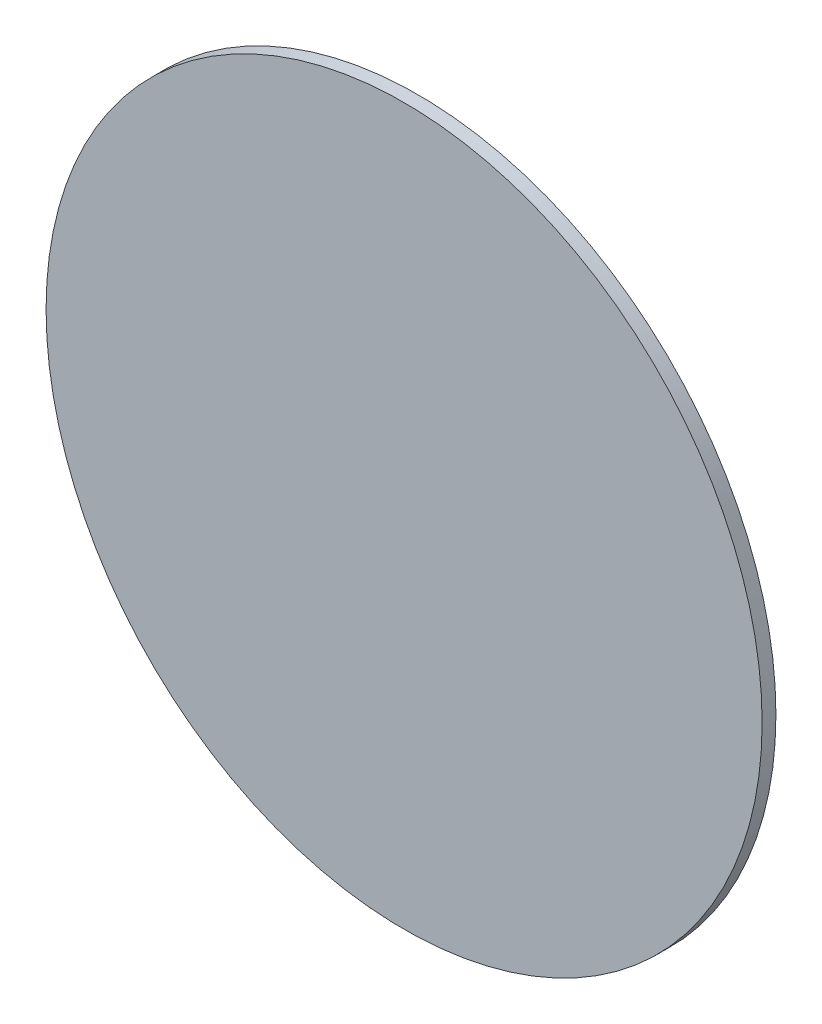
ISO-10303-21;
HEADER;
FILE_DESCRIPTION(('STEP AP214'),'2;1');
FILE_NAME('part.step','',(''),(''),'','','');
FILE_SCHEMA(('AUTOMOTIVE_DESIGN { 1 0 10303 214 1 1 1 1 }'));
ENDSEC;
DATA;
#1=APPLICATION_CONTEXT('core data for automotive mechanical design processes');
#2=APPLICATION_PROTOCOL_DEFINITION('international standard','automotive_design',2000,#1);
#3=PRODUCT_CONTEXT('',#1,'mechanical');
#4=PRODUCT('Part','Part','',(#3));
#5=PRODUCT_RELATED_PRODUCT_CATEGORY('part','',(#4));
#6=PRODUCT_DEFINITION_FORMATION('','',#4);
#7=PRODUCT_DEFINITION_CONTEXT('part definition',#1,'design');
#8=PRODUCT_DEFINITION('design','',#6,#7);
#9=PRODUCT_DEFINITION_SHAPE('','',#8);
#10=(LENGTH_UNIT() NAMED_UNIT(*) SI_UNIT(.MILLI.,.METRE.));
#11=(NAMED_UNIT(*) PLANE_ANGLE_UNIT() SI_UNIT($,.RADIAN.));
#12=(NAMED_UNIT(*) SI_UNIT($,.STERADIAN.) SOLID_ANGLE_UNIT());
#13=UNCERTAINTY_MEASURE_WITH_UNIT(LENGTH_MEASURE(1.E-05),#10,'distance_accuracy_value','');
#14=(GEOMETRIC_REPRESENTATION_CONTEXT(3) GLOBAL_UNCERTAINTY_ASSIGNED_CONTEXT((#13)) GLOBAL_UNIT_ASSIGNED_CONTEXT((#10,
#11,#12)) REPRESENTATION_CONTEXT('',''));
#15=CARTESIAN_POINT('',(0.,0.,0.));
#16=DIRECTION('',(0.,0.,1.));
#17=DIRECTION('',(1.,0.,0.));
#18=AXIS2_PLACEMENT_3D('',#15,#16,#17);
#19=CARTESIAN_POINT('',(0.,0.,3.175));
#20=DIRECTION('',(0.,0.,-1.));
#21=DIRECTION('',(-1.,0.,0.));
#22=AXIS2_PLACEMENT_3D('',#19,#20,#21);
#23=CYLINDRICAL_SURFACE('',#22,82.5);
#24=CARTESIAN_POINT('',(0.,0.,3.175));
#25=DIRECTION('',(0.,0.,1.));
#26=DIRECTION('',(1.,0.,0.));
#27=AXIS2_PLACEMENT_3D('',#24,#25,#26);
#28=CIRCLE('',#27,82.5);
#29=CARTESIAN_POINT('',(82.5,0.,3.175));
#30=VERTEX_POINT('',#29);
#31=EDGE_CURVE('E10',#30,#30,#28,.T.);
#32=ORIENTED_EDGE('',*,*,#31,.F.);
#33=EDGE_LOOP('',(#32));
#34=FACE_BOUND('',#33,.T.);
#35=CARTESIAN_POINT('',(0.,0.,0.));
#36=DIRECTION('',(0.,0.,1.));
#37=DIRECTION('',(1.,0.,0.));
#38=AXIS2_PLACEMENT_3D('',#35,#36,#37);
#39=CIRCLE('',#38,82.5);
#40=CARTESIAN_POINT('',(82.5,0.,0.));
#41=VERTEX_POINT('',#40);
#42=EDGE_CURVE('E33',#41,#41,#39,.T.);
#43=ORIENTED_EDGE('',*,*,#42,.T.);
#44=EDGE_LOOP('',(#43));
#45=FACE_BOUND('',#44,.T.);
#46=ADVANCED_FACE('F30',(#34,#45),#23,.T.);
#47=CARTESIAN_POINT('',(0.,0.,3.175));
#48=DIRECTION('',(0.,0.,1.));
#49=DIRECTION('',(1.,0.,0.));
#50=AXIS2_PLACEMENT_3D('',#47,#48,#49);
#51=PLANE('',#50);
#52=ORIENTED_EDGE('',*,*,#31,.T.);
#53=EDGE_LOOP('',(#52));
#54=FACE_BOUND('',#53,.T.);
#55=ADVANCED_FACE('F45',(#54),#51,.T.);
#56=CARTESIAN_POINT('',(0.,0.,0.));
#57=DIRECTION('',(0.,0.,1.));
#58=DIRECTION('',(1.,0.,0.));
#59=AXIS2_PLACEMENT_3D('',#56,#57,#58);
#60=PLANE('',#59);
#61=ORIENTED_EDGE('',*,*,#42,.F.);
#62=EDGE_LOOP('',(#61));
#63=FACE_BOUND('',#62,.T.);
#64=ADVANCED_FACE('F43',(#63),#60,.F.);
#65=CLOSED_SHELL('',(#46,#55,#64));
#66=MANIFOLD_SOLID_BREP('B2',#65);
#67=ADVANCED_BREP_SHAPE_REPRESENTATION('',(#18,#66),#14);
#68=SHAPE_DEFINITION_REPRESENTATION(#9,#67);
ENDSEC;
END-ISO-10303-21;
